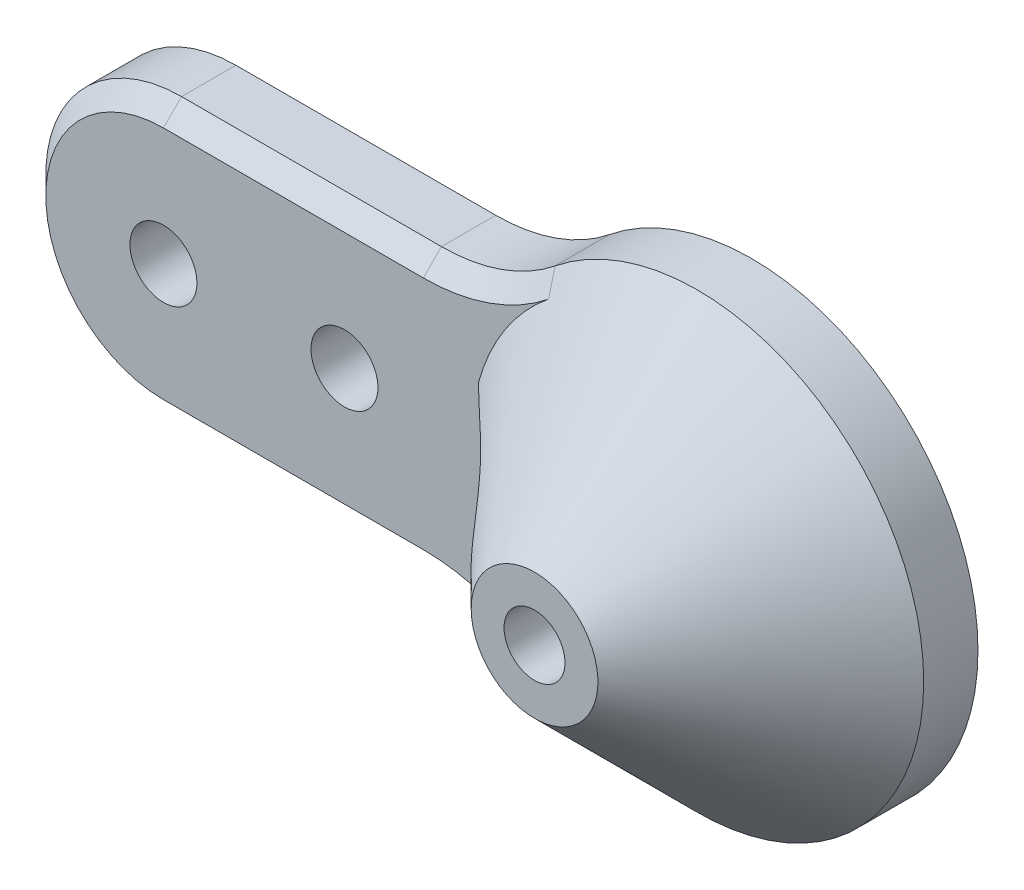
ISO-10303-21;
HEADER;
FILE_DESCRIPTION(('STEP AP214'),'2;1');
FILE_NAME('part.step','',(''),(''),'','','');
FILE_SCHEMA(('AUTOMOTIVE_DESIGN { 1 0 10303 214 1 1 1 1 }'));
ENDSEC;
DATA;
#1=APPLICATION_CONTEXT('core data for automotive mechanical design processes');
#2=APPLICATION_PROTOCOL_DEFINITION('international standard','automotive_design',2000,#1);
#3=PRODUCT_CONTEXT('',#1,'mechanical');
#4=PRODUCT('Part','Part','',(#3));
#5=PRODUCT_RELATED_PRODUCT_CATEGORY('part','',(#4));
#6=PRODUCT_DEFINITION_FORMATION('','',#4);
#7=PRODUCT_DEFINITION_CONTEXT('part definition',#1,'design');
#8=PRODUCT_DEFINITION('design','',#6,#7);
#9=PRODUCT_DEFINITION_SHAPE('','',#8);
#10=(LENGTH_UNIT() NAMED_UNIT(*) SI_UNIT(.MILLI.,.METRE.));
#11=(NAMED_UNIT(*) PLANE_ANGLE_UNIT() SI_UNIT($,.RADIAN.));
#12=(NAMED_UNIT(*) SI_UNIT($,.STERADIAN.) SOLID_ANGLE_UNIT());
#13=UNCERTAINTY_MEASURE_WITH_UNIT(LENGTH_MEASURE(1.E-05),#10,'distance_accuracy_value','');
#14=(GEOMETRIC_REPRESENTATION_CONTEXT(3) GLOBAL_UNCERTAINTY_ASSIGNED_CONTEXT((#13)) GLOBAL_UNIT_ASSIGNED_CONTEXT((#10,
#11,#12)) REPRESENTATION_CONTEXT('',''));
#15=CARTESIAN_POINT('',(0.,0.,0.));
#16=DIRECTION('',(0.,0.,1.));
#17=DIRECTION('',(1.,0.,0.));
#18=AXIS2_PLACEMENT_3D('',#15,#16,#17);
#19=CARTESIAN_POINT('',(152.4,0.,4.));
#20=DIRECTION('',(0.,0.,-1.));
#21=DIRECTION('',(-1.,0.,0.));
#22=AXIS2_PLACEMENT_3D('',#19,#20,#21);
#23=CONICAL_SURFACE('',#22,11.4999999999999,0.785398163397447);
#24=CARTESIAN_POINT('',(152.4,0.,11.9999999999999));
#25=DIRECTION('',(0.,0.,-1.));
#26=DIRECTION('',(-1.,0.,0.));
#27=AXIS2_PLACEMENT_3D('',#24,#25,#26);
#28=CIRCLE('',#27,3.5);
#29=CARTESIAN_POINT('',(148.9,0.,11.9999999999999));
#30=VERTEX_POINT('',#29);
#31=EDGE_CURVE('E293',#30,#30,#28,.T.);
#32=ORIENTED_EDGE('',*,*,#31,.T.);
#33=EDGE_LOOP('',(#32));
#34=FACE_BOUND('',#33,.T.);
#35=CARTESIAN_POINT('',(152.4,0.,4.));
#36=DIRECTION('',(0.,0.,-1.));
#37=DIRECTION('',(-1.,0.,0.));
#38=AXIS2_PLACEMENT_3D('',#35,#36,#37);
#39=CIRCLE('',#38,11.4999999999999);
#40=CARTESIAN_POINT('',(141.298198344413,3.00000000000003,4.));
#41=VERTEX_POINT('',#40);
#42=CARTESIAN_POINT('',(145.171797347871,8.94444444444444,4.));
#43=VERTEX_POINT('',#42);
#44=EDGE_CURVE('E148',#41,#43,#39,.T.);
#45=ORIENTED_EDGE('',*,*,#44,.F.);
#46=CARTESIAN_POINT('',(133.782437589234,3.00000000000002,-3.35772070317022));
#47=CARTESIAN_POINT('',(134.142713965535,3.00000000000002,-3.0020359118315));
#48=CARTESIAN_POINT('',(134.503117458899,3.00000000000002,-2.64647981434668));
#49=CARTESIAN_POINT('',(135.224237519435,3.00000000000002,-1.9356846619147));
#50=CARTESIAN_POINT('',(135.584954086866,3.00000000000002,-1.58044560722999));
#51=CARTESIAN_POINT('',(136.667667541759,3.00000000000002,-0.515287705932016));
#52=CARTESIAN_POINT('',(137.390221419825,3.00000000000002,0.194065197686756));
#53=CARTESIAN_POINT('',(138.837363501141,3.00000000000002,1.61033746998806));
#54=CARTESIAN_POINT('',(139.561951156688,3.00000000000002,2.31725739747233));
#55=CARTESIAN_POINT('',(140.651533026794,3.00000000000002,3.37486138161853));
#56=CARTESIAN_POINT('',(141.015178371815,3.00000000000002,3.72693466377141));
#57=CARTESIAN_POINT('',(141.74366192746,3.00000000000002,4.42984487691356));
#58=CARTESIAN_POINT('',(142.108500136358,3.00000000000002,4.78068180969053));
#59=CARTESIAN_POINT('',(142.845252821765,3.00000000000002,5.48592678807924));
#60=CARTESIAN_POINT('',(143.217191444171,3.00000000000002,5.84030962487162));
#61=CARTESIAN_POINT('',(143.963349783092,3.00000000000002,6.54664851140912));
#62=CARTESIAN_POINT('',(144.337569429213,3.00000000000002,6.89860463533638));
#63=CARTESIAN_POINT('',(144.901436084451,3.00000000000002,7.42387222368585));
#64=CARTESIAN_POINT('',(145.089828621219,3.00000000000002,7.59852989119629));
#65=CARTESIAN_POINT('',(145.467650740639,3.00000000000002,7.94671698470334));
#66=CARTESIAN_POINT('',(145.657080313273,3.00000000000002,8.1202464215629));
#67=CARTESIAN_POINT('',(146.037241425158,3.00000000000002,8.46591291451119));
#68=CARTESIAN_POINT('',(146.227973087483,3.00000000000002,8.63804983552214));
#69=CARTESIAN_POINT('',(146.611097452828,3.00000000000002,8.98047664544518));
#70=CARTESIAN_POINT('',(146.803490210874,3.00000000000002,9.1507664727444));
#71=CARTESIAN_POINT('',(146.996895717273,3.00000000000002,9.31990810019607));
#72=B_SPLINE_CURVE_WITH_KNOTS('',3,(#46,#47,#48,#49,#50,#51,#52,#53,#54,#55,#56,#57,#58,#59,#60,
#61,#62,#63,#64,#65,#66,#67,#68,#69,#70,#71),.UNSPECIFIED.,.F.,.F.,(4,2,2,2,2,2,2,2,2,2,2,2,4),
(0.,1.5188142415662,3.03762973922673,6.07528925030744,9.11219700755488,10.6306619012948,
12.1491245985029,13.6903286457864,15.2314853692684,16.0021784988569,16.7728641969659,
17.5436237781893,18.3144089907965),.UNSPECIFIED.);
#73=CARTESIAN_POINT('',(143.9,3.00000000000002,6.48612181133988));
#74=VERTEX_POINT('',#73);
#75=EDGE_CURVE('E11',#41,#74,#72,.T.);
#76=ORIENTED_EDGE('',*,*,#75,.T.);
#77=CARTESIAN_POINT('',(143.8998,-2.9999999933333,6.48593321524616));
#78=CARTESIAN_POINT('',(144.018411764068,-2.99998356907871,6.59776234760683));
#79=CARTESIAN_POINT('',(144.135933914575,-2.99298258951133,6.71068084324947));
#80=CARTESIAN_POINT('',(144.367927112093,-2.9655893571366,6.93798707175009));
#81=CARTESIAN_POINT('',(144.482398677379,-2.94519939431927,7.05237455008044));
#82=CARTESIAN_POINT('',(144.708920786425,-2.89125777048453,7.28343806975463));
#83=CARTESIAN_POINT('',(144.82092061121,-2.85753868742554,7.40012454360038));
#84=CARTESIAN_POINT('',(145.040174857529,-2.77734245392091,7.6335748812508));
#85=CARTESIAN_POINT('',(145.147429218418,-2.73086514048515,7.75033874602515));
#86=CARTESIAN_POINT('',(145.356967359982,-2.62508850936804,7.98366909360171));
#87=CARTESIAN_POINT('',(145.459224381619,-2.56572783319997,8.10023184397493));
#88=CARTESIAN_POINT('',(145.657478239149,-2.43422053962695,8.33157983745806));
#89=CARTESIAN_POINT('',(145.753472591502,-2.36206889145723,8.4463643617951));
#90=CARTESIAN_POINT('',(145.937762735885,-2.20501858171724,8.67206514699122));
#91=CARTESIAN_POINT('',(146.026097821742,-2.12019191702913,8.78299915437868));
#92=CARTESIAN_POINT('',(146.194437104458,-1.93676149239328,8.99951951984532));
#93=CARTESIAN_POINT('',(146.27445139097,-1.8381747657592,9.10511227287822));
#94=CARTESIAN_POINT('',(146.413305718971,-1.64179824033754,9.29264643767131));
#95=CARTESIAN_POINT('',(146.473521020832,-1.54611271973307,9.37575814440446));
#96=CARTESIAN_POINT('',(146.585236296711,-1.34274025308215,9.53282956258731));
#97=CARTESIAN_POINT('',(146.636741685342,-1.23506083275686,9.60679495220238));
#98=CARTESIAN_POINT('',(146.721442647004,-1.02479768340569,9.73036504650511));
#99=CARTESIAN_POINT('',(146.75624278308,-0.924061158380329,9.78197092590063));
#100=CARTESIAN_POINT('',(146.815875240231,-0.713819715044849,9.87131205298282));
#101=CARTESIAN_POINT('',(146.8407259481,-0.604331423835469,9.90907287569891));
#102=CARTESIAN_POINT('',(146.874467650055,-0.401156393377381,9.96063309500336));
#103=CARTESIAN_POINT('',(146.885554463387,-0.30867915872683,9.97771126085642));
#104=CARTESIAN_POINT('',(146.898995726558,-0.121621974908834,9.99843761889437));
#105=CARTESIAN_POINT('',(146.901357663921,-0.0270438988101966,10.0020973265284));
#106=CARTESIAN_POINT('',(146.897137332646,0.161423127197178,9.99557700495509));
#107=CARTESIAN_POINT('',(146.890554260539,0.25531201443925,9.98539573250899));
#108=CARTESIAN_POINT('',(146.869039539106,0.439843938993699,9.95233457333874));
#109=CARTESIAN_POINT('',(146.854099382085,0.530483568271641,9.92944174614939));
#110=CARTESIAN_POINT('',(146.810448723755,0.737612577666639,9.86317442383573));
#111=CARTESIAN_POINT('',(146.778749786639,0.852057518330115,9.81543708285094));
#112=CARTESIAN_POINT('',(146.70490276492,1.07046530565543,9.70606941078496));
#113=CARTESIAN_POINT('',(146.662730113444,1.17440268786395,9.64440644740639));
#114=CARTESIAN_POINT('',(146.579833580187,1.35126989771921,9.52541957262218));
#115=CARTESIAN_POINT('',(146.540637515262,1.42614904591385,9.46986702100237));
#116=CARTESIAN_POINT('',(146.457845922244,1.56980989184965,9.35427312761899));
#117=CARTESIAN_POINT('',(146.414247850406,1.63858802043491,9.2942291957187));
#118=CARTESIAN_POINT('',(146.323175561776,1.77049544375716,9.17071579816744));
#119=CARTESIAN_POINT('',(146.275694623451,1.83361452878708,9.10724045972569));
#120=CARTESIAN_POINT('',(146.177343886323,1.95442356859062,8.97778022670013));
#121=CARTESIAN_POINT('',(146.126473018846,2.01211179732789,8.91179454357092));
#122=CARTESIAN_POINT('',(145.994344353586,2.15107416956919,8.74304103226022));
#123=CARTESIAN_POINT('',(145.911077176942,2.22895539452339,8.63904039234019));
#124=CARTESIAN_POINT('',(145.738370496533,2.37340841275657,8.42830806131771));
#125=CARTESIAN_POINT('',(145.648927947056,2.43997456856941,8.32157503916238));
#126=CARTESIAN_POINT('',(145.464594696728,2.56208177746759,8.10652631613645));
#127=CARTESIAN_POINT('',(145.369703802265,2.61762243844223,7.9982105591245));
#128=CARTESIAN_POINT('',(145.175096306623,2.71773812709499,7.78085660818257));
#129=CARTESIAN_POINT('',(145.075379812978,2.76231339899463,7.67181843039794));
#130=CARTESIAN_POINT('',(144.88877784734,2.83382416186763,7.47198497630866));
#131=CARTESIAN_POINT('',(144.802538592265,2.86246340339994,7.38119121000975));
#132=CARTESIAN_POINT('',(144.62749675324,2.91187506724708,7.19995382833432));
#133=CARTESIAN_POINT('',(144.538694550361,2.93264865264135,7.10951016314817));
#134=CARTESIAN_POINT('',(144.359202767847,2.96604794546828,6.9296086294517));
#135=CARTESIAN_POINT('',(144.268520638477,2.97870113685284,6.84014845377526));
#136=CARTESIAN_POINT('',(144.085379696345,2.99567702452259,6.6622120303981));
#137=CARTESIAN_POINT('',(143.992920371779,2.99999728362318,6.57373607807961));
#138=CARTESIAN_POINT('',(143.8998,2.99999999333336,6.48593321524616));
#139=B_SPLINE_CURVE_WITH_KNOTS('',3,(#77,#78,#79,#80,#81,#82,#83,#84,#85,#86,#87,#88,#89,#90,
#91,#92,#93,#94,#95,#96,#97,#98,#99,#100,#101,#102,#103,#104,#105,#106,#107,#108,#109,#110,#111,
#112,#113,#114,#115,#116,#117,#118,#119,#120,#121,#122,#123,#124,#125,#126,#127,#128,#129,#130,
#131,#132,#133,#134,#135,#136,#137,#138),.UNSPECIFIED.,.F.,.F.,(4,2,2,2,2,2,2,2,2,2,2,2,2,2,2,2,
2,2,2,2,2,2,2,2,2,2,2,2,2,2,4),(0.,0.48882884726208,0.977574109259693,1.47266400083312,
1.96776021761842,2.46526825839769,2.96297240790358,3.45795000241812,3.95232022018187,
4.37243849726463,4.79229463530644,5.14633525220255,5.49971853921912,5.78254799542688,
6.0651346762367,6.34774674151562,6.63064703702271,7.01247582444787,7.39520882100577,
7.69822397043458,8.00141523344445,8.30514292867812,8.60896683113502,9.07126771990641,
9.53379826833472,9.99634526325368,10.4588819553767,10.8439945382421,11.2290501529908,
11.6127955538231,11.9966531740531),.UNSPECIFIED.);
#140=CARTESIAN_POINT('',(143.9,-2.99999999999997,6.4861218113399));
#141=VERTEX_POINT('',#140);
#142=EDGE_CURVE('E142',#141,#74,#139,.T.);
#143=ORIENTED_EDGE('',*,*,#142,.F.);
#144=CARTESIAN_POINT('',(133.782437589234,-2.99999999999997,-3.35772070317024));
#145=CARTESIAN_POINT('',(134.142713965535,-2.99999999999997,-3.00203591183152));
#146=CARTESIAN_POINT('',(134.503117458899,-2.99999999999997,-2.6464798143467));
#147=CARTESIAN_POINT('',(135.224237519435,-2.99999999999997,-1.93568466191472));
#148=CARTESIAN_POINT('',(135.584954086866,-2.99999999999997,-1.58044560723002));
#149=CARTESIAN_POINT('',(136.667667541759,-2.99999999999997,-0.515287705932046));
#150=CARTESIAN_POINT('',(137.390221419825,-2.99999999999997,0.194065197686737));
#151=CARTESIAN_POINT('',(138.837363501141,-2.99999999999997,1.61033746998804));
#152=CARTESIAN_POINT('',(139.561951156688,-2.99999999999997,2.31725739747231));
#153=CARTESIAN_POINT('',(140.651533026794,-2.99999999999997,3.37486138161852));
#154=CARTESIAN_POINT('',(141.015178371815,-2.99999999999997,3.72693466377141));
#155=CARTESIAN_POINT('',(141.74366192746,-2.99999999999997,4.42984487691356));
#156=CARTESIAN_POINT('',(142.108500136358,-2.99999999999997,4.78068180969052));
#157=CARTESIAN_POINT('',(142.845252821765,-2.99999999999997,5.48592678807925));
#158=CARTESIAN_POINT('',(143.217191444171,-2.99999999999997,5.84030962487165));
#159=CARTESIAN_POINT('',(143.963349783092,-2.99999999999997,6.54664851140917));
#160=CARTESIAN_POINT('',(144.337569429213,-2.99999999999997,6.89860463533644));
#161=CARTESIAN_POINT('',(144.901436084451,-2.99999999999997,7.42387222368593));
#162=CARTESIAN_POINT('',(145.089828621219,-2.99999999999997,7.59852989119637));
#163=CARTESIAN_POINT('',(145.467650740639,-2.99999999999997,7.94671698470343));
#164=CARTESIAN_POINT('',(145.657080313273,-2.99999999999997,8.12024642156299));
#165=CARTESIAN_POINT('',(146.037241425158,-2.99999999999997,8.46591291451129));
#166=CARTESIAN_POINT('',(146.227973087483,-2.99999999999997,8.63804983552224));
#167=CARTESIAN_POINT('',(146.611097452828,-2.99999999999997,8.98047664544528));
#168=CARTESIAN_POINT('',(146.803490210874,-2.99999999999997,9.1507664727445));
#169=CARTESIAN_POINT('',(146.996895717273,-2.99999999999997,9.31990810019617));
#170=B_SPLINE_CURVE_WITH_KNOTS('',3,(#144,#145,#146,#147,#148,#149,#150,#151,#152,#153,#154,
#155,#156,#157,#158,#159,#160,#161,#162,#163,#164,#165,#166,#167,#168,#169),.UNSPECIFIED.,.F.,
.F.,(4,2,2,2,2,2,2,2,2,2,2,2,4),(0.,1.51881424156619,3.03762973922672,6.07528925030744,
9.11219700755488,10.6306619012948,12.1491245985029,13.6903286457865,15.2314853692685,
16.0021784988571,16.7728641969661,17.5436237781894,18.3144089907966),.UNSPECIFIED.);
#171=CARTESIAN_POINT('',(141.298198344413,-2.99999999999997,4.));
#172=VERTEX_POINT('',#171);
#173=EDGE_CURVE('E45',#172,#141,#170,.T.);
#174=ORIENTED_EDGE('',*,*,#173,.F.);
#175=CARTESIAN_POINT('',(145.171797347871,-8.94444444444435,4.));
#176=VERTEX_POINT('',#175);
#177=EDGE_CURVE('E140',#176,#172,#39,.T.);
#178=ORIENTED_EDGE('',*,*,#177,.F.);
#179=DIRECTION('',(0.444444444444439,0.549971940922869,0.707106781186551));
#180=VECTOR('',#179,1.);
#181=CARTESIAN_POINT('',(144.543257986816,-9.72222222222213,3.));
#182=LINE('',#181,#180);
#183=CARTESIAN_POINT('',(144.543257986816,-9.72222222222213,3.));
#184=VERTEX_POINT('',#183);
#185=EDGE_CURVE('E161',#184,#176,#182,.T.);
#186=ORIENTED_EDGE('',*,*,#185,.F.);
#187=CARTESIAN_POINT('',(152.4,0.,3.));
#188=DIRECTION('',(0.,0.,-1.));
#189=DIRECTION('',(-1.,0.,0.));
#190=AXIS2_PLACEMENT_3D('',#187,#188,#189);
#191=CIRCLE('',#190,12.4999999999999);
#192=CARTESIAN_POINT('',(144.543257986816,9.72222222222223,3.));
#193=VERTEX_POINT('',#192);
#194=EDGE_CURVE('E151',#193,#184,#191,.T.);
#195=ORIENTED_EDGE('',*,*,#194,.F.);
#196=DIRECTION('',(-0.444444444444437,0.549971940922876,-0.707106781186548));
#197=VECTOR('',#196,1.);
#198=CARTESIAN_POINT('',(145.171797347871,8.94444444444444,4.));
#199=LINE('',#198,#197);
#200=EDGE_CURVE('E157',#43,#193,#199,.T.);
#201=ORIENTED_EDGE('',*,*,#200,.F.);
#202=EDGE_LOOP('',(#45,#76,#143,#174,#178,#186,#195,#201));
#203=FACE_BOUND('',#202,.T.);
#204=ADVANCED_FACE('F33',(#34,#203),#23,.T.);
#205=CARTESIAN_POINT('',(138.257864376269,-17.4999999999999,4.));
#206=DIRECTION('',(0.,0.,-1.));
#207=DIRECTION('',(-1.,0.,0.));
#208=AXIS2_PLACEMENT_3D('',#205,#206,#207);
#209=PLANE('',#208);
#210=CARTESIAN_POINT('',(138.257864376269,-17.4999999999999,4.));
#211=DIRECTION('',(0.,0.,-1.));
#212=DIRECTION('',(-1.,0.,0.));
#213=AXIS2_PLACEMENT_3D('',#210,#211,#212);
#214=CIRCLE('',#213,11.);
#215=CARTESIAN_POINT('',(138.257864376269,-6.4999999999999,4.));
#216=VERTEX_POINT('',#215);
#217=EDGE_CURVE('E146',#216,#176,#214,.T.);
#218=ORIENTED_EDGE('',*,*,#217,.T.);
#219=ORIENTED_EDGE('',*,*,#177,.T.);
#220=DIRECTION('',(-1.,0.,0.));
#221=VECTOR('',#220,1.);
#222=CARTESIAN_POINT('',(143.9,-2.99999999999997,4.));
#223=LINE('',#222,#221);
#224=CARTESIAN_POINT('',(143.9,-2.99999999999997,4.));
#225=VERTEX_POINT('',#224);
#226=EDGE_CURVE('E127',#225,#172,#223,.T.);
#227=ORIENTED_EDGE('',*,*,#226,.F.);
#228=CARTESIAN_POINT('',(143.9,0.,4.));
#229=DIRECTION('',(0.,0.,-1.));
#230=DIRECTION('',(-1.,0.,0.));
#231=AXIS2_PLACEMENT_3D('',#228,#229,#230);
#232=CIRCLE('',#231,2.99999999999999);
#233=CARTESIAN_POINT('',(143.9,3.00000000000002,4.));
#234=VERTEX_POINT('',#233);
#235=EDGE_CURVE('E134',#234,#225,#232,.T.);
#236=ORIENTED_EDGE('',*,*,#235,.F.);
#237=DIRECTION('',(-1.,0.,0.));
#238=VECTOR('',#237,1.);
#239=CARTESIAN_POINT('',(143.9,3.00000000000002,4.));
#240=LINE('',#239,#238);
#241=EDGE_CURVE('E52',#234,#41,#240,.T.);
#242=ORIENTED_EDGE('',*,*,#241,.T.);
#243=ORIENTED_EDGE('',*,*,#44,.T.);
#244=CARTESIAN_POINT('',(138.257864376269,17.5000000000001,4.));
#245=DIRECTION('',(0.,0.,-1.));
#246=DIRECTION('',(-1.,0.,0.));
#247=AXIS2_PLACEMENT_3D('',#244,#245,#246);
#248=CIRCLE('',#247,11.);
#249=CARTESIAN_POINT('',(138.257864376269,6.5000000000001,4.));
#250=VERTEX_POINT('',#249);
#251=EDGE_CURVE('E164',#43,#250,#248,.T.);
#252=ORIENTED_EDGE('',*,*,#251,.T.);
#253=DIRECTION('',(-1.,0.,0.));
#254=VECTOR('',#253,1.);
#255=CARTESIAN_POINT('',(138.257864376269,6.5000000000001,4.));
#256=LINE('',#255,#254);
#257=CARTESIAN_POINT('',(123.9,6.5000000000001,4.));
#258=VERTEX_POINT('',#257);
#259=EDGE_CURVE('E170',#250,#258,#256,.T.);
#260=ORIENTED_EDGE('',*,*,#259,.T.);
#261=CARTESIAN_POINT('',(123.9,1.035652129618E-13,4.));
#262=DIRECTION('',(0.,0.,-1.));
#263=DIRECTION('',(-1.,0.,0.));
#264=AXIS2_PLACEMENT_3D('',#261,#262,#263);
#265=CIRCLE('',#264,6.5);
#266=CARTESIAN_POINT('',(123.9,-6.4999999999999,4.));
#267=VERTEX_POINT('',#266);
#268=EDGE_CURVE('E357',#258,#267,#265,.F.);
#269=ORIENTED_EDGE('',*,*,#268,.T.);
#270=DIRECTION('',(1.,0.,0.));
#271=VECTOR('',#270,1.);
#272=CARTESIAN_POINT('',(138.257864376269,-6.4999999999999,4.));
#273=LINE('',#272,#271);
#274=EDGE_CURVE('E355',#267,#216,#273,.T.);
#275=ORIENTED_EDGE('',*,*,#274,.T.);
#276=EDGE_LOOP('',(#218,#219,#227,#236,#242,#243,#252,#260,#269,#275));
#277=FACE_BOUND('',#276,.T.);
#278=CARTESIAN_POINT('',(133.9,1.57329099321661E-13,4.));
#279=DIRECTION('',(0.,0.,1.));
#280=DIRECTION('',(1.,0.,0.));
#281=AXIS2_PLACEMENT_3D('',#278,#279,#280);
#282=CIRCLE('',#281,1.85);
#283=CARTESIAN_POINT('',(135.75,1.57329099321661E-13,4.));
#284=VERTEX_POINT('',#283);
#285=EDGE_CURVE('E311',#284,#284,#282,.T.);
#286=ORIENTED_EDGE('',*,*,#285,.F.);
#287=EDGE_LOOP('',(#286));
#288=FACE_BOUND('',#287,.T.);
#289=CARTESIAN_POINT('',(123.9,1.035652129618E-13,4.));
#290=DIRECTION('',(0.,0.,1.));
#291=DIRECTION('',(1.,0.,0.));
#292=AXIS2_PLACEMENT_3D('',#289,#290,#291);
#293=CIRCLE('',#292,1.84999999999999);
#294=CARTESIAN_POINT('',(125.75,1.035652129618E-13,4.));
#295=VERTEX_POINT('',#294);
#296=EDGE_CURVE('E305',#295,#295,#293,.T.);
#297=ORIENTED_EDGE('',*,*,#296,.F.);
#298=EDGE_LOOP('',(#297));
#299=FACE_BOUND('',#298,.T.);
#300=CARTESIAN_POINT('',(143.9,0.,4.));
#301=DIRECTION('',(0.,0.,-1.));
#302=DIRECTION('',(-1.,0.,0.));
#303=AXIS2_PLACEMENT_3D('',#300,#301,#302);
#304=CIRCLE('',#303,1.85);
#305=CARTESIAN_POINT('',(142.05,0.,4.));
#306=VERTEX_POINT('',#305);
#307=EDGE_CURVE('E414',#306,#306,#304,.T.);
#308=ORIENTED_EDGE('',*,*,#307,.T.);
#309=EDGE_LOOP('',(#308));
#310=FACE_BOUND('',#309,.T.);
#311=ADVANCED_FACE('F143',(#277,#288,#299,#310),#209,.F.);
#312=CARTESIAN_POINT('',(138.257864376269,-17.4999999999999,0.));
#313=DIRECTION('',(0.,0.,-1.));
#314=DIRECTION('',(-1.,0.,0.));
#315=AXIS2_PLACEMENT_3D('',#312,#313,#314);
#316=PLANE('',#315);
#317=CARTESIAN_POINT('',(152.4,8.5,0.));
#318=DIRECTION('',(0.,0.,-1.));
#319=DIRECTION('',(-1.,0.,0.));
#320=AXIS2_PLACEMENT_3D('',#317,#318,#319);
#321=CIRCLE('',#320,1.85);
#322=CARTESIAN_POINT('',(150.55,8.5,0.));
#323=VERTEX_POINT('',#322);
#324=EDGE_CURVE('E446',#323,#323,#321,.T.);
#325=ORIENTED_EDGE('',*,*,#324,.F.);
#326=EDGE_LOOP('',(#325));
#327=FACE_BOUND('',#326,.T.);
#328=CARTESIAN_POINT('',(152.4,-8.50000000000001,0.));
#329=DIRECTION('',(0.,0.,-1.));
#330=DIRECTION('',(-1.,0.,0.));
#331=AXIS2_PLACEMENT_3D('',#328,#329,#330);
#332=CIRCLE('',#331,1.85);
#333=CARTESIAN_POINT('',(150.55,-8.50000000000001,0.));
#334=VERTEX_POINT('',#333);
#335=EDGE_CURVE('E440',#334,#334,#332,.T.);
#336=ORIENTED_EDGE('',*,*,#335,.F.);
#337=EDGE_LOOP('',(#336));
#338=FACE_BOUND('',#337,.T.);
#339=CARTESIAN_POINT('',(133.9,1.57329099321661E-13,0.));
#340=DIRECTION('',(0.,0.,1.));
#341=DIRECTION('',(1.,0.,0.));
#342=AXIS2_PLACEMENT_3D('',#339,#340,#341);
#343=CIRCLE('',#342,1.85);
#344=CARTESIAN_POINT('',(135.75,1.57329099321661E-13,0.));
#345=VERTEX_POINT('',#344);
#346=EDGE_CURVE('E308',#345,#345,#343,.T.);
#347=ORIENTED_EDGE('',*,*,#346,.T.);
#348=EDGE_LOOP('',(#347));
#349=FACE_BOUND('',#348,.T.);
#350=CARTESIAN_POINT('',(152.4,0.,0.));
#351=DIRECTION('',(0.,0.,1.));
#352=DIRECTION('',(1.,0.,0.));
#353=AXIS2_PLACEMENT_3D('',#350,#351,#352);
#354=CIRCLE('',#353,5.00000000000002);
#355=CARTESIAN_POINT('',(157.4,0.,0.));
#356=VERTEX_POINT('',#355);
#357=EDGE_CURVE('E319',#356,#356,#354,.T.);
#358=ORIENTED_EDGE('',*,*,#357,.T.);
#359=EDGE_LOOP('',(#358));
#360=FACE_BOUND('',#359,.T.);
#361=CARTESIAN_POINT('',(138.257864376269,-17.4999999999999,0.));
#362=DIRECTION('',(0.,0.,-1.));
#363=DIRECTION('',(-1.,0.,0.));
#364=AXIS2_PLACEMENT_3D('',#361,#362,#363);
#365=CIRCLE('',#364,10.);
#366=CARTESIAN_POINT('',(138.257864376269,-7.4999999999999,0.));
#367=VERTEX_POINT('',#366);
#368=CARTESIAN_POINT('',(144.543257986816,-9.72222222222213,0.));
#369=VERTEX_POINT('',#368);
#370=EDGE_CURVE('E325',#367,#369,#365,.T.);
#371=ORIENTED_EDGE('',*,*,#370,.F.);
#372=DIRECTION('',(1.,0.,0.));
#373=VECTOR('',#372,1.);
#374=CARTESIAN_POINT('',(123.9,-7.4999999999999,0.));
#375=LINE('',#374,#373);
#376=CARTESIAN_POINT('',(123.9,-7.4999999999999,0.));
#377=VERTEX_POINT('',#376);
#378=EDGE_CURVE('E340',#377,#367,#375,.T.);
#379=ORIENTED_EDGE('',*,*,#378,.F.);
#380=CARTESIAN_POINT('',(123.9,1.035652129618E-13,0.));
#381=DIRECTION('',(0.,0.,1.));
#382=DIRECTION('',(1.,0.,0.));
#383=AXIS2_PLACEMENT_3D('',#380,#381,#382);
#384=CIRCLE('',#383,7.5);
#385=CARTESIAN_POINT('',(123.9,7.5000000000001,0.));
#386=VERTEX_POINT('',#385);
#387=EDGE_CURVE('E337',#386,#377,#384,.T.);
#388=ORIENTED_EDGE('',*,*,#387,.F.);
#389=DIRECTION('',(-1.,0.,0.));
#390=VECTOR('',#389,1.);
#391=CARTESIAN_POINT('',(123.9,7.5000000000001,0.));
#392=LINE('',#391,#390);
#393=CARTESIAN_POINT('',(138.257864376269,7.5000000000001,0.));
#394=VERTEX_POINT('',#393);
#395=EDGE_CURVE('E334',#394,#386,#392,.T.);
#396=ORIENTED_EDGE('',*,*,#395,.F.);
#397=CARTESIAN_POINT('',(138.257864376269,17.5000000000001,0.));
#398=DIRECTION('',(0.,0.,-1.));
#399=DIRECTION('',(1.,0.,0.));
#400=AXIS2_PLACEMENT_3D('',#397,#398,#399);
#401=CIRCLE('',#400,10.);
#402=CARTESIAN_POINT('',(144.543257986816,9.72222222222223,0.));
#403=VERTEX_POINT('',#402);
#404=EDGE_CURVE('E331',#403,#394,#401,.T.);
#405=ORIENTED_EDGE('',*,*,#404,.F.);
#406=CARTESIAN_POINT('',(152.4,0.,0.));
#407=DIRECTION('',(0.,0.,1.));
#408=DIRECTION('',(1.,0.,0.));
#409=AXIS2_PLACEMENT_3D('',#406,#407,#408);
#410=CIRCLE('',#409,12.4999999999999);
#411=EDGE_CURVE('E328',#369,#403,#410,.T.);
#412=ORIENTED_EDGE('',*,*,#411,.F.);
#413=EDGE_LOOP('',(#371,#379,#388,#396,#405,#412));
#414=FACE_BOUND('',#413,.T.);
#415=CARTESIAN_POINT('',(160.9,0.,0.));
#416=DIRECTION('',(0.,0.,1.));
#417=DIRECTION('',(1.,0.,0.));
#418=AXIS2_PLACEMENT_3D('',#415,#416,#417);
#419=CIRCLE('',#418,1.85);
#420=CARTESIAN_POINT('',(162.75,0.,0.));
#421=VERTEX_POINT('',#420);
#422=EDGE_CURVE('E321',#421,#421,#419,.T.);
#423=ORIENTED_EDGE('',*,*,#422,.T.);
#424=EDGE_LOOP('',(#423));
#425=FACE_BOUND('',#424,.T.);
#426=CARTESIAN_POINT('',(143.9,0.,0.));
#427=DIRECTION('',(0.,0.,1.));
#428=DIRECTION('',(1.,0.,0.));
#429=AXIS2_PLACEMENT_3D('',#426,#427,#428);
#430=CIRCLE('',#429,1.85);
#431=CARTESIAN_POINT('',(145.75,0.,0.));
#432=VERTEX_POINT('',#431);
#433=EDGE_CURVE('E314',#432,#432,#430,.T.);
#434=ORIENTED_EDGE('',*,*,#433,.T.);
#435=EDGE_LOOP('',(#434));
#436=FACE_BOUND('',#435,.T.);
#437=CARTESIAN_POINT('',(123.9,1.035652129618E-13,0.));
#438=DIRECTION('',(0.,0.,1.));
#439=DIRECTION('',(1.,0.,0.));
#440=AXIS2_PLACEMENT_3D('',#437,#438,#439);
#441=CIRCLE('',#440,1.84999999999999);
#442=CARTESIAN_POINT('',(125.75,1.035652129618E-13,0.));
#443=VERTEX_POINT('',#442);
#444=EDGE_CURVE('E160',#443,#443,#441,.T.);
#445=ORIENTED_EDGE('',*,*,#444,.T.);
#446=EDGE_LOOP('',(#445));
#447=FACE_BOUND('',#446,.T.);
#448=ADVANCED_FACE('F243',(#327,#338,#349,#360,#414,#425,#436,#447),#316,.T.);
#449=CARTESIAN_POINT('',(138.257864376269,-17.4999999999999,4.));
#450=DIRECTION('',(0.,0.,-1.));
#451=DIRECTION('',(-1.,0.,0.));
#452=AXIS2_PLACEMENT_3D('',#449,#450,#451);
#453=CYLINDRICAL_SURFACE('',#452,10.);
#454=DIRECTION('',(0.,0.,-1.));
#455=VECTOR('',#454,1.);
#456=CARTESIAN_POINT('',(144.543257986816,-9.72222222222213,4.));
#457=LINE('',#456,#455);
#458=EDGE_CURVE('E166',#184,#369,#457,.T.);
#459=ORIENTED_EDGE('',*,*,#458,.F.);
#460=CARTESIAN_POINT('',(138.257864376269,-17.4999999999999,3.));
#461=DIRECTION('',(0.,0.,-1.));
#462=DIRECTION('',(-1.,0.,0.));
#463=AXIS2_PLACEMENT_3D('',#460,#461,#462);
#464=CIRCLE('',#463,10.);
#465=CARTESIAN_POINT('',(138.257864376269,-7.4999999999999,3.));
#466=VERTEX_POINT('',#465);
#467=EDGE_CURVE('E367',#184,#466,#464,.F.);
#468=ORIENTED_EDGE('',*,*,#467,.T.);
#469=DIRECTION('',(0.,0.,-1.));
#470=VECTOR('',#469,1.);
#471=CARTESIAN_POINT('',(138.257864376269,-7.4999999999999,4.));
#472=LINE('',#471,#470);
#473=EDGE_CURVE('E343',#466,#367,#472,.T.);
#474=ORIENTED_EDGE('',*,*,#473,.T.);
#475=ORIENTED_EDGE('',*,*,#370,.T.);
#476=EDGE_LOOP('',(#459,#468,#474,#475));
#477=FACE_BOUND('',#476,.T.);
#478=ADVANCED_FACE('F246',(#477),#453,.F.);
#479=CARTESIAN_POINT('',(152.4,0.,4.));
#480=DIRECTION('',(0.,0.,-1.));
#481=DIRECTION('',(-1.,0.,0.));
#482=AXIS2_PLACEMENT_3D('',#479,#480,#481);
#483=CYLINDRICAL_SURFACE('',#482,12.4999999999999);
#484=DIRECTION('',(0.,0.,-1.));
#485=VECTOR('',#484,1.);
#486=CARTESIAN_POINT('',(144.543257986816,9.72222222222223,4.));
#487=LINE('',#486,#485);
#488=EDGE_CURVE('E351',#193,#403,#487,.T.);
#489=ORIENTED_EDGE('',*,*,#488,.F.);
#490=ORIENTED_EDGE('',*,*,#194,.T.);
#491=ORIENTED_EDGE('',*,*,#458,.T.);
#492=ORIENTED_EDGE('',*,*,#411,.T.);
#493=EDGE_LOOP('',(#489,#490,#491,#492));
#494=FACE_BOUND('',#493,.T.);
#495=ADVANCED_FACE('F262',(#494),#483,.T.);
#496=CARTESIAN_POINT('',(138.257864376269,17.5000000000001,4.));
#497=DIRECTION('',(0.,0.,-1.));
#498=DIRECTION('',(-1.,0.,0.));
#499=AXIS2_PLACEMENT_3D('',#496,#497,#498);
#500=CYLINDRICAL_SURFACE('',#499,10.);
#501=DIRECTION('',(0.,0.,-1.));
#502=VECTOR('',#501,1.);
#503=CARTESIAN_POINT('',(138.257864376269,7.5000000000001,4.));
#504=LINE('',#503,#502);
#505=CARTESIAN_POINT('',(138.257864376269,7.5000000000001,3.));
#506=VERTEX_POINT('',#505);
#507=EDGE_CURVE('E349',#506,#394,#504,.T.);
#508=ORIENTED_EDGE('',*,*,#507,.F.);
#509=CARTESIAN_POINT('',(138.257864376269,17.5000000000001,3.));
#510=DIRECTION('',(0.,0.,-1.));
#511=DIRECTION('',(-1.,0.,0.));
#512=AXIS2_PLACEMENT_3D('',#509,#510,#511);
#513=CIRCLE('',#512,10.);
#514=EDGE_CURVE('E60',#506,#193,#513,.F.);
#515=ORIENTED_EDGE('',*,*,#514,.T.);
#516=ORIENTED_EDGE('',*,*,#488,.T.);
#517=ORIENTED_EDGE('',*,*,#404,.T.);
#518=EDGE_LOOP('',(#508,#515,#516,#517));
#519=FACE_BOUND('',#518,.T.);
#520=ADVANCED_FACE('F258',(#519),#500,.F.);
#521=CARTESIAN_POINT('',(123.9,7.5000000000001,4.));
#522=DIRECTION('',(0.,-1.,0.));
#523=DIRECTION('',(0.,0.,-1.));
#524=AXIS2_PLACEMENT_3D('',#521,#522,#523);
#525=PLANE('',#524);
#526=DIRECTION('',(0.,0.,-1.));
#527=VECTOR('',#526,1.);
#528=CARTESIAN_POINT('',(123.9,7.5000000000001,4.));
#529=LINE('',#528,#527);
#530=CARTESIAN_POINT('',(123.9,7.5000000000001,3.));
#531=VERTEX_POINT('',#530);
#532=EDGE_CURVE('E347',#531,#386,#529,.T.);
#533=ORIENTED_EDGE('',*,*,#532,.F.);
#534=DIRECTION('',(1.,0.,0.));
#535=VECTOR('',#534,1.);
#536=CARTESIAN_POINT('',(123.9,7.5000000000001,3.));
#537=LINE('',#536,#535);
#538=EDGE_CURVE('E365',#531,#506,#537,.T.);
#539=ORIENTED_EDGE('',*,*,#538,.T.);
#540=ORIENTED_EDGE('',*,*,#507,.T.);
#541=ORIENTED_EDGE('',*,*,#395,.T.);
#542=EDGE_LOOP('',(#533,#539,#540,#541));
#543=FACE_BOUND('',#542,.T.);
#544=ADVANCED_FACE('F254',(#543),#525,.F.);
#545=CARTESIAN_POINT('',(123.9,1.035652129618E-13,4.));
#546=DIRECTION('',(0.,0.,-1.));
#547=DIRECTION('',(-1.,0.,0.));
#548=AXIS2_PLACEMENT_3D('',#545,#546,#547);
#549=CYLINDRICAL_SURFACE('',#548,7.5);
#550=DIRECTION('',(0.,0.,-1.));
#551=VECTOR('',#550,1.);
#552=CARTESIAN_POINT('',(123.9,-7.4999999999999,4.));
#553=LINE('',#552,#551);
#554=CARTESIAN_POINT('',(123.9,-7.4999999999999,3.));
#555=VERTEX_POINT('',#554);
#556=EDGE_CURVE('E345',#555,#377,#553,.T.);
#557=ORIENTED_EDGE('',*,*,#556,.F.);
#558=CARTESIAN_POINT('',(123.9,1.035652129618E-13,3.));
#559=DIRECTION('',(0.,0.,-1.));
#560=DIRECTION('',(-1.,0.,0.));
#561=AXIS2_PLACEMENT_3D('',#558,#559,#560);
#562=CIRCLE('',#561,7.5);
#563=EDGE_CURVE('E360',#555,#531,#562,.T.);
#564=ORIENTED_EDGE('',*,*,#563,.T.);
#565=ORIENTED_EDGE('',*,*,#532,.T.);
#566=ORIENTED_EDGE('',*,*,#387,.T.);
#567=EDGE_LOOP('',(#557,#564,#565,#566));
#568=FACE_BOUND('',#567,.T.);
#569=ADVANCED_FACE('F250',(#568),#549,.T.);
#570=CARTESIAN_POINT('',(123.9,-7.4999999999999,4.));
#571=DIRECTION('',(0.,1.,0.));
#572=DIRECTION('',(0.,0.,1.));
#573=AXIS2_PLACEMENT_3D('',#570,#571,#572);
#574=PLANE('',#573);
#575=ORIENTED_EDGE('',*,*,#473,.F.);
#576=DIRECTION('',(-1.,0.,0.));
#577=VECTOR('',#576,1.);
#578=CARTESIAN_POINT('',(123.9,-7.4999999999999,3.));
#579=LINE('',#578,#577);
#580=EDGE_CURVE('E363',#466,#555,#579,.T.);
#581=ORIENTED_EDGE('',*,*,#580,.T.);
#582=ORIENTED_EDGE('',*,*,#556,.T.);
#583=ORIENTED_EDGE('',*,*,#378,.T.);
#584=EDGE_LOOP('',(#575,#581,#582,#583));
#585=FACE_BOUND('',#584,.T.);
#586=ADVANCED_FACE('F239',(#585),#574,.F.);
#587=CARTESIAN_POINT('',(160.9,0.,4.));
#588=DIRECTION('',(0.,0.,-1.));
#589=DIRECTION('',(-1.,0.,0.));
#590=AXIS2_PLACEMENT_3D('',#587,#588,#589);
#591=CYLINDRICAL_SURFACE('',#590,1.85);
#592=CARTESIAN_POINT('',(160.9,0.,4.));
#593=DIRECTION('',(0.,0.,1.));
#594=DIRECTION('',(1.,0.,0.));
#595=AXIS2_PLACEMENT_3D('',#592,#593,#594);
#596=CIRCLE('',#595,1.85);
#597=CARTESIAN_POINT('',(162.75,0.,4.));
#598=VERTEX_POINT('',#597);
#599=EDGE_CURVE('E294',#598,#598,#596,.T.);
#600=ORIENTED_EDGE('',*,*,#599,.T.);
#601=EDGE_LOOP('',(#600));
#602=FACE_BOUND('',#601,.T.);
#603=ORIENTED_EDGE('',*,*,#422,.F.);
#604=EDGE_LOOP('',(#603));
#605=FACE_BOUND('',#604,.T.);
#606=ADVANCED_FACE('F235',(#602,#605),#591,.F.);
#607=CARTESIAN_POINT('',(152.4,0.,4.));
#608=DIRECTION('',(0.,0.,-1.));
#609=DIRECTION('',(-1.,0.,0.));
#610=AXIS2_PLACEMENT_3D('',#607,#608,#609);
#611=CYLINDRICAL_SURFACE('',#610,5.00000000000002);
#612=ORIENTED_EDGE('',*,*,#357,.F.);
#613=EDGE_LOOP('',(#612));
#614=FACE_BOUND('',#613,.T.);
#615=CARTESIAN_POINT('',(152.4,0.,7.67157287525368));
#616=DIRECTION('',(0.,0.,-1.));
#617=DIRECTION('',(-1.,0.,0.));
#618=AXIS2_PLACEMENT_3D('',#615,#616,#617);
#619=CIRCLE('',#618,5.);
#620=CARTESIAN_POINT('',(147.4,0.,7.67157287525368));
#621=VERTEX_POINT('',#620);
#622=EDGE_CURVE('E420',#621,#621,#619,.T.);
#623=ORIENTED_EDGE('',*,*,#622,.F.);
#624=EDGE_LOOP('',(#623));
#625=FACE_BOUND('',#624,.T.);
#626=ADVANCED_FACE('F231',(#614,#625),#611,.F.);
#627=CARTESIAN_POINT('',(143.9,0.,4.));
#628=DIRECTION('',(0.,0.,-1.));
#629=DIRECTION('',(-1.,0.,0.));
#630=AXIS2_PLACEMENT_3D('',#627,#628,#629);
#631=CYLINDRICAL_SURFACE('',#630,1.85);
#632=ORIENTED_EDGE('',*,*,#307,.F.);
#633=EDGE_LOOP('',(#632));
#634=FACE_BOUND('',#633,.T.);
#635=ORIENTED_EDGE('',*,*,#433,.F.);
#636=EDGE_LOOP('',(#635));
#637=FACE_BOUND('',#636,.T.);
#638=ADVANCED_FACE('F227',(#634,#637),#631,.F.);
#639=CARTESIAN_POINT('',(133.9,1.57329099321661E-13,4.));
#640=DIRECTION('',(0.,0.,-1.));
#641=DIRECTION('',(-1.,0.,0.));
#642=AXIS2_PLACEMENT_3D('',#639,#640,#641);
#643=CYLINDRICAL_SURFACE('',#642,1.85);
#644=ORIENTED_EDGE('',*,*,#285,.T.);
#645=EDGE_LOOP('',(#644));
#646=FACE_BOUND('',#645,.T.);
#647=ORIENTED_EDGE('',*,*,#346,.F.);
#648=EDGE_LOOP('',(#647));
#649=FACE_BOUND('',#648,.T.);
#650=ADVANCED_FACE('F223',(#646,#649),#643,.F.);
#651=CARTESIAN_POINT('',(123.9,1.035652129618E-13,4.));
#652=DIRECTION('',(0.,0.,-1.));
#653=DIRECTION('',(-1.,0.,0.));
#654=AXIS2_PLACEMENT_3D('',#651,#652,#653);
#655=CYLINDRICAL_SURFACE('',#654,1.84999999999999);
#656=ORIENTED_EDGE('',*,*,#296,.T.);
#657=EDGE_LOOP('',(#656));
#658=FACE_BOUND('',#657,.T.);
#659=ORIENTED_EDGE('',*,*,#444,.F.);
#660=EDGE_LOOP('',(#659));
#661=FACE_BOUND('',#660,.T.);
#662=ADVANCED_FACE('F219',(#658,#661),#655,.F.);
#663=CARTESIAN_POINT('',(138.257864376269,17.5000000000001,4.));
#664=DIRECTION('',(0.,0.,1.));
#665=DIRECTION('',(1.,0.,0.));
#666=AXIS2_PLACEMENT_3D('',#663,#664,#665);
#667=CONICAL_SURFACE('',#666,11.,0.785398163397449);
#668=ORIENTED_EDGE('',*,*,#200,.T.);
#669=ORIENTED_EDGE('',*,*,#514,.F.);
#670=DIRECTION('',(0.,0.707106781186548,-0.707106781186547));
#671=VECTOR('',#670,1.);
#672=CARTESIAN_POINT('',(138.257864376269,6.5000000000001,4.));
#673=LINE('',#672,#671);
#674=EDGE_CURVE('E174',#250,#506,#673,.T.);
#675=ORIENTED_EDGE('',*,*,#674,.F.);
#676=ORIENTED_EDGE('',*,*,#251,.F.);
#677=EDGE_LOOP('',(#668,#669,#675,#676));
#678=FACE_BOUND('',#677,.T.);
#679=ADVANCED_FACE('F222',(#678),#667,.F.);
#680=CARTESIAN_POINT('',(138.257864376269,-17.4999999999999,4.));
#681=DIRECTION('',(0.,0.,1.));
#682=DIRECTION('',(1.,0.,0.));
#683=AXIS2_PLACEMENT_3D('',#680,#681,#682);
#684=CONICAL_SURFACE('',#683,11.,0.785398163397449);
#685=ORIENTED_EDGE('',*,*,#185,.T.);
#686=ORIENTED_EDGE('',*,*,#217,.F.);
#687=DIRECTION('',(0.,0.707106781186549,0.707106781186546));
#688=VECTOR('',#687,1.);
#689=CARTESIAN_POINT('',(138.257864376269,-7.4999999999999,3.));
#690=LINE('',#689,#688);
#691=EDGE_CURVE('E374',#466,#216,#690,.T.);
#692=ORIENTED_EDGE('',*,*,#691,.F.);
#693=ORIENTED_EDGE('',*,*,#467,.F.);
#694=EDGE_LOOP('',(#685,#686,#692,#693));
#695=FACE_BOUND('',#694,.T.);
#696=ADVANCED_FACE('F279',(#695),#684,.F.);
#697=CARTESIAN_POINT('',(138.257864376269,6.5000000000001,4.));
#698=DIRECTION('',(0.,-0.707106781186548,-0.707106781186548));
#699=DIRECTION('',(-1.,0.,0.));
#700=AXIS2_PLACEMENT_3D('',#697,#698,#699);
#701=PLANE('',#700);
#702=ORIENTED_EDGE('',*,*,#674,.T.);
#703=ORIENTED_EDGE('',*,*,#538,.F.);
#704=DIRECTION('',(0.,0.707106781186548,-0.707106781186548));
#705=VECTOR('',#704,1.);
#706=CARTESIAN_POINT('',(123.9,6.5000000000001,4.));
#707=LINE('',#706,#705);
#708=EDGE_CURVE('E372',#258,#531,#707,.T.);
#709=ORIENTED_EDGE('',*,*,#708,.F.);
#710=ORIENTED_EDGE('',*,*,#259,.F.);
#711=EDGE_LOOP('',(#702,#703,#709,#710));
#712=FACE_BOUND('',#711,.T.);
#713=ADVANCED_FACE('F275',(#712),#701,.F.);
#714=CARTESIAN_POINT('',(138.257864376269,-6.4999999999999,4.));
#715=DIRECTION('',(0.,0.707106781186547,-0.707106781186548));
#716=DIRECTION('',(1.,0.,0.));
#717=AXIS2_PLACEMENT_3D('',#714,#715,#716);
#718=PLANE('',#717);
#719=ORIENTED_EDGE('',*,*,#691,.T.);
#720=ORIENTED_EDGE('',*,*,#274,.F.);
#721=DIRECTION('',(0.,0.707106781186548,0.707106781186547));
#722=VECTOR('',#721,1.);
#723=CARTESIAN_POINT('',(123.9,-7.4999999999999,3.));
#724=LINE('',#723,#722);
#725=EDGE_CURVE('E298',#555,#267,#724,.T.);
#726=ORIENTED_EDGE('',*,*,#725,.F.);
#727=ORIENTED_EDGE('',*,*,#580,.F.);
#728=EDGE_LOOP('',(#719,#720,#726,#727));
#729=FACE_BOUND('',#728,.T.);
#730=ADVANCED_FACE('F271',(#729),#718,.F.);
#731=CARTESIAN_POINT('',(123.9,1.035652129618E-13,4.));
#732=DIRECTION('',(0.,0.,-1.));
#733=DIRECTION('',(-1.,0.,0.));
#734=AXIS2_PLACEMENT_3D('',#731,#732,#733);
#735=CONICAL_SURFACE('',#734,6.5,0.785398163397449);
#736=ORIENTED_EDGE('',*,*,#708,.T.);
#737=ORIENTED_EDGE('',*,*,#563,.F.);
#738=ORIENTED_EDGE('',*,*,#725,.T.);
#739=ORIENTED_EDGE('',*,*,#268,.F.);
#740=EDGE_LOOP('',(#736,#737,#738,#739));
#741=FACE_BOUND('',#740,.T.);
#742=ADVANCED_FACE('F207',(#741),#735,.T.);
#743=CARTESIAN_POINT('',(152.4,0.,7.67157287525368));
#744=DIRECTION('',(0.,0.,-1.));
#745=DIRECTION('',(-1.,0.,0.));
#746=AXIS2_PLACEMENT_3D('',#743,#744,#745);
#747=CONICAL_SURFACE('',#746,5.,0.785398163397447);
#748=CARTESIAN_POINT('',(152.4,0.,8.99999999999987));
#749=DIRECTION('',(0.,0.,-1.));
#750=DIRECTION('',(-1.,0.,0.));
#751=AXIS2_PLACEMENT_3D('',#748,#749,#750);
#752=CIRCLE('',#751,3.67157287525381);
#753=CARTESIAN_POINT('',(148.728427124746,0.,8.99999999999987));
#754=VERTEX_POINT('',#753);
#755=EDGE_CURVE('E423',#754,#754,#752,.T.);
#756=ORIENTED_EDGE('',*,*,#755,.F.);
#757=EDGE_LOOP('',(#756));
#758=FACE_BOUND('',#757,.T.);
#759=ORIENTED_EDGE('',*,*,#622,.T.);
#760=EDGE_LOOP('',(#759));
#761=FACE_BOUND('',#760,.T.);
#762=ADVANCED_FACE('F203',(#758,#761),#747,.F.);
#763=CARTESIAN_POINT('',(152.4,-1.68334263323027,8.99999999999987));
#764=DIRECTION('',(0.,0.,1.));
#765=DIRECTION('',(1.,0.,0.));
#766=AXIS2_PLACEMENT_3D('',#763,#764,#765);
#767=PLANE('',#766);
#768=CARTESIAN_POINT('',(152.4,0.,8.99999999999987));
#769=DIRECTION('',(0.,0.,-1.));
#770=DIRECTION('',(-1.,0.,0.));
#771=AXIS2_PLACEMENT_3D('',#768,#769,#770);
#772=CIRCLE('',#771,1.68334263323027);
#773=CARTESIAN_POINT('',(150.71665736677,0.,8.99999999999987));
#774=VERTEX_POINT('',#773);
#775=EDGE_CURVE('E301',#774,#774,#772,.T.);
#776=ORIENTED_EDGE('',*,*,#775,.F.);
#777=EDGE_LOOP('',(#776));
#778=FACE_BOUND('',#777,.T.);
#779=ORIENTED_EDGE('',*,*,#755,.T.);
#780=EDGE_LOOP('',(#779));
#781=FACE_BOUND('',#780,.T.);
#782=ADVANCED_FACE('F206',(#778,#781),#767,.F.);
#783=CARTESIAN_POINT('',(152.4,0.,0.));
#784=DIRECTION('',(0.,0.,-1.));
#785=DIRECTION('',(-1.,0.,0.));
#786=AXIS2_PLACEMENT_3D('',#783,#784,#785);
#787=CYLINDRICAL_SURFACE('',#786,1.68334263323027);
#788=CARTESIAN_POINT('',(152.4,0.,11.9999999999999));
#789=DIRECTION('',(0.,0.,-1.));
#790=DIRECTION('',(-1.,0.,0.));
#791=AXIS2_PLACEMENT_3D('',#788,#789,#790);
#792=CIRCLE('',#791,1.68334263323027);
#793=CARTESIAN_POINT('',(150.71665736677,0.,11.9999999999999));
#794=VERTEX_POINT('',#793);
#795=EDGE_CURVE('E295',#794,#794,#792,.T.);
#796=ORIENTED_EDGE('',*,*,#795,.F.);
#797=EDGE_LOOP('',(#796));
#798=FACE_BOUND('',#797,.T.);
#799=ORIENTED_EDGE('',*,*,#775,.T.);
#800=EDGE_LOOP('',(#799));
#801=FACE_BOUND('',#800,.T.);
#802=ADVANCED_FACE('F211',(#798,#801),#787,.F.);
#803=CARTESIAN_POINT('',(152.4,-3.5,11.9999999999999));
#804=DIRECTION('',(0.,0.,-1.));
#805=DIRECTION('',(-1.,0.,0.));
#806=AXIS2_PLACEMENT_3D('',#803,#804,#805);
#807=PLANE('',#806);
#808=ORIENTED_EDGE('',*,*,#31,.F.);
#809=EDGE_LOOP('',(#808));
#810=FACE_BOUND('',#809,.T.);
#811=ORIENTED_EDGE('',*,*,#795,.T.);
#812=EDGE_LOOP('',(#811));
#813=FACE_BOUND('',#812,.T.);
#814=ADVANCED_FACE('F201',(#810,#813),#807,.F.);
#815=CARTESIAN_POINT('',(152.4,-11.4999999999999,4.));
#816=DIRECTION('',(0.,0.,1.));
#817=DIRECTION('',(1.,0.,0.));
#818=AXIS2_PLACEMENT_3D('',#815,#816,#817);
#819=PLANE('',#818);
#820=ORIENTED_EDGE('',*,*,#599,.F.);
#821=EDGE_LOOP('',(#820));
#822=FACE_BOUND('',#821,.T.);
#823=ADVANCED_FACE('F197',(#822),#819,.F.);
#824=CARTESIAN_POINT('',(143.9,3.00000000000002,11.9999999999999));
#825=DIRECTION('',(0.,-1.,0.));
#826=DIRECTION('',(0.,0.,-1.));
#827=AXIS2_PLACEMENT_3D('',#824,#825,#826);
#828=PLANE('',#827);
#829=ORIENTED_EDGE('',*,*,#241,.F.);
#830=DIRECTION('',(0.,0.,-1.));
#831=VECTOR('',#830,1.);
#832=CARTESIAN_POINT('',(143.9,3.00000000000002,11.9999999999999));
#833=LINE('',#832,#831);
#834=EDGE_CURVE('E412',#74,#234,#833,.T.);
#835=ORIENTED_EDGE('',*,*,#834,.F.);
#836=ORIENTED_EDGE('',*,*,#75,.F.);
#837=EDGE_LOOP('',(#829,#835,#836));
#838=FACE_BOUND('',#837,.T.);
#839=ADVANCED_FACE('F193',(#838),#828,.T.);
#840=CARTESIAN_POINT('',(143.9,-2.99999999999997,11.9999999999999));
#841=DIRECTION('',(0.,-1.,0.));
#842=DIRECTION('',(0.,0.,-1.));
#843=AXIS2_PLACEMENT_3D('',#840,#841,#842);
#844=PLANE('',#843);
#845=ORIENTED_EDGE('',*,*,#173,.T.);
#846=DIRECTION('',(0.,0.,-1.));
#847=VECTOR('',#846,1.);
#848=CARTESIAN_POINT('',(143.9,-2.99999999999997,11.9999999999999));
#849=LINE('',#848,#847);
#850=EDGE_CURVE('E131',#141,#225,#849,.T.);
#851=ORIENTED_EDGE('',*,*,#850,.T.);
#852=ORIENTED_EDGE('',*,*,#226,.T.);
#853=EDGE_LOOP('',(#845,#851,#852));
#854=FACE_BOUND('',#853,.T.);
#855=ADVANCED_FACE('F129',(#854),#844,.F.);
#856=CARTESIAN_POINT('',(143.9,0.,11.9999999999999));
#857=DIRECTION('',(0.,0.,-1.));
#858=DIRECTION('',(-1.,0.,0.));
#859=AXIS2_PLACEMENT_3D('',#856,#857,#858);
#860=CYLINDRICAL_SURFACE('',#859,2.99999999999999);
#861=ORIENTED_EDGE('',*,*,#142,.T.);
#862=ORIENTED_EDGE('',*,*,#834,.T.);
#863=ORIENTED_EDGE('',*,*,#235,.T.);
#864=ORIENTED_EDGE('',*,*,#850,.F.);
#865=EDGE_LOOP('',(#861,#862,#863,#864));
#866=FACE_BOUND('',#865,.T.);
#867=ADVANCED_FACE('F184',(#866),#860,.F.);
#868=CARTESIAN_POINT('',(152.4,-11.4999999999999,4.));
#869=DIRECTION('',(0.,0.,1.));
#870=DIRECTION('',(1.,0.,0.));
#871=AXIS2_PLACEMENT_3D('',#868,#869,#870);
#872=PLANE('',#871);
#873=CARTESIAN_POINT('',(152.4,-8.50000000000001,4.));
#874=DIRECTION('',(0.,0.,1.));
#875=DIRECTION('',(1.,0.,0.));
#876=AXIS2_PLACEMENT_3D('',#873,#874,#875);
#877=CIRCLE('',#876,1.85);
#878=CARTESIAN_POINT('',(154.25,-8.50000000000001,4.));
#879=VERTEX_POINT('',#878);
#880=EDGE_CURVE('E437',#879,#879,#877,.F.);
#881=ORIENTED_EDGE('',*,*,#880,.T.);
#882=EDGE_LOOP('',(#881));
#883=FACE_BOUND('',#882,.T.);
#884=ADVANCED_FACE('F188',(#883),#872,.F.);
#885=CARTESIAN_POINT('',(152.4,-8.50000000000001,9.23259018078044));
#886=DIRECTION('',(0.,0.,-1.));
#887=DIRECTION('',(-1.,0.,0.));
#888=AXIS2_PLACEMENT_3D('',#885,#886,#887);
#889=CYLINDRICAL_SURFACE('',#888,1.85);
#890=ORIENTED_EDGE('',*,*,#335,.T.);
#891=EDGE_LOOP('',(#890));
#892=FACE_BOUND('',#891,.T.);
#893=ORIENTED_EDGE('',*,*,#880,.F.);
#894=EDGE_LOOP('',(#893));
#895=FACE_BOUND('',#894,.T.);
#896=ADVANCED_FACE('F460',(#892,#895),#889,.F.);
#897=CARTESIAN_POINT('',(152.4,-11.4999999999999,4.));
#898=DIRECTION('',(0.,0.,1.));
#899=DIRECTION('',(1.,0.,0.));
#900=AXIS2_PLACEMENT_3D('',#897,#898,#899);
#901=PLANE('',#900);
#902=CARTESIAN_POINT('',(152.4,8.5,4.));
#903=DIRECTION('',(0.,0.,1.));
#904=DIRECTION('',(1.,0.,0.));
#905=AXIS2_PLACEMENT_3D('',#902,#903,#904);
#906=CIRCLE('',#905,1.85);
#907=CARTESIAN_POINT('',(154.25,8.5,4.));
#908=VERTEX_POINT('',#907);
#909=EDGE_CURVE('E443',#908,#908,#906,.F.);
#910=ORIENTED_EDGE('',*,*,#909,.T.);
#911=EDGE_LOOP('',(#910));
#912=FACE_BOUND('',#911,.T.);
#913=ADVANCED_FACE('F463',(#912),#901,.F.);
#914=CARTESIAN_POINT('',(152.4,8.5,9.23259018078044));
#915=DIRECTION('',(0.,0.,-1.));
#916=DIRECTION('',(-1.,0.,0.));
#917=AXIS2_PLACEMENT_3D('',#914,#915,#916);
#918=CYLINDRICAL_SURFACE('',#917,1.85);
#919=ORIENTED_EDGE('',*,*,#324,.T.);
#920=EDGE_LOOP('',(#919));
#921=FACE_BOUND('',#920,.T.);
#922=ORIENTED_EDGE('',*,*,#909,.F.);
#923=EDGE_LOOP('',(#922));
#924=FACE_BOUND('',#923,.T.);
#925=ADVANCED_FACE('F450',(#921,#924),#918,.F.);
#926=CLOSED_SHELL('',(#204,#311,#448,#478,#495,#520,#544,#569,#586,#606,#626,#638,#650,#662,
#679,#696,#713,#730,#742,#762,#782,#802,#814,#823,#839,#855,#867,#884,#896,#913,#925));
#927=MANIFOLD_SOLID_BREP('B2',#926);
#928=ADVANCED_BREP_SHAPE_REPRESENTATION('',(#18,#927),#14);
#929=SHAPE_DEFINITION_REPRESENTATION(#9,#928);
ENDSEC;
END-ISO-10303-21;
